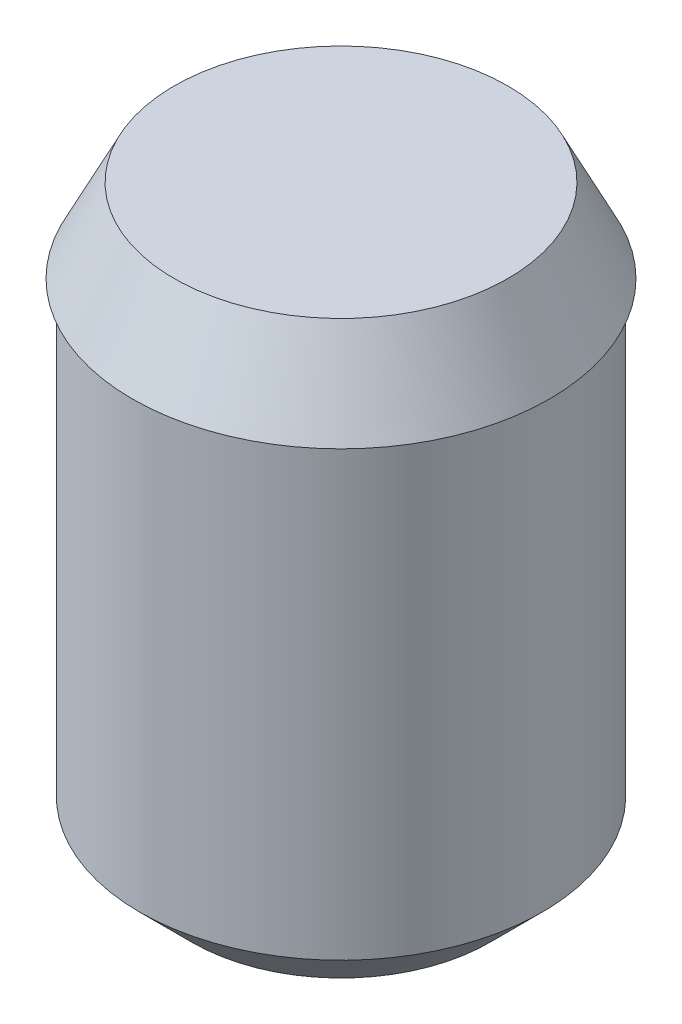
ISO-10303-21;
HEADER;
FILE_DESCRIPTION(('STEP AP214'),'2;1');
FILE_NAME('part.step','',(''),(''),'','','');
FILE_SCHEMA(('AUTOMOTIVE_DESIGN { 1 0 10303 214 1 1 1 1 }'));
ENDSEC;
DATA;
#1=APPLICATION_CONTEXT('core data for automotive mechanical design processes');
#2=APPLICATION_PROTOCOL_DEFINITION('international standard','automotive_design',2000,#1);
#3=PRODUCT_CONTEXT('',#1,'mechanical');
#4=PRODUCT('Part','Part','',(#3));
#5=PRODUCT_RELATED_PRODUCT_CATEGORY('part','',(#4));
#6=PRODUCT_DEFINITION_FORMATION('','',#4);
#7=PRODUCT_DEFINITION_CONTEXT('part definition',#1,'design');
#8=PRODUCT_DEFINITION('design','',#6,#7);
#9=PRODUCT_DEFINITION_SHAPE('','',#8);
#10=(LENGTH_UNIT() NAMED_UNIT(*) SI_UNIT(.MILLI.,.METRE.));
#11=(NAMED_UNIT(*) PLANE_ANGLE_UNIT() SI_UNIT($,.RADIAN.));
#12=(NAMED_UNIT(*) SI_UNIT($,.STERADIAN.) SOLID_ANGLE_UNIT());
#13=UNCERTAINTY_MEASURE_WITH_UNIT(LENGTH_MEASURE(1.E-05),#10,'distance_accuracy_value','');
#14=(GEOMETRIC_REPRESENTATION_CONTEXT(3) GLOBAL_UNCERTAINTY_ASSIGNED_CONTEXT((#13)) GLOBAL_UNIT_ASSIGNED_CONTEXT((#10,
#11,#12)) REPRESENTATION_CONTEXT('',''));
#15=CARTESIAN_POINT('',(0.,0.,0.));
#16=DIRECTION('',(0.,0.,1.));
#17=DIRECTION('',(1.,0.,0.));
#18=AXIS2_PLACEMENT_3D('',#15,#16,#17);
#19=CARTESIAN_POINT('',(0.,7.,0.));
#20=DIRECTION('',(0.,-1.,0.));
#21=DIRECTION('',(0.,0.,-1.));
#22=AXIS2_PLACEMENT_3D('',#19,#20,#21);
#23=PLANE('',#22);
#24=CARTESIAN_POINT('',(0.,7.,0.));
#25=DIRECTION('',(0.,-1.,0.));
#26=DIRECTION('',(0.,0.,-1.));
#27=AXIS2_PLACEMENT_3D('',#24,#25,#26);
#28=CIRCLE('',#27,2.);
#29=CARTESIAN_POINT('',(0.,7.,-2.));
#30=VERTEX_POINT('',#29);
#31=EDGE_CURVE('E10',#30,#30,#28,.T.);
#32=ORIENTED_EDGE('',*,*,#31,.F.);
#33=EDGE_LOOP('',(#32));
#34=FACE_BOUND('',#33,.T.);
#35=ADVANCED_FACE('F45',(#34),#23,.F.);
#36=CARTESIAN_POINT('',(0.,7.,0.));
#37=DIRECTION('',(0.,-1.,0.));
#38=DIRECTION('',(0.,0.,-1.));
#39=AXIS2_PLACEMENT_3D('',#36,#37,#38);
#40=CONICAL_SURFACE('',#39,2.,0.463647609000807);
#41=CARTESIAN_POINT('',(0.,6.,0.));
#42=DIRECTION('',(0.,1.,0.));
#43=DIRECTION('',(0.,0.,1.));
#44=AXIS2_PLACEMENT_3D('',#41,#42,#43);
#45=CIRCLE('',#44,2.5);
#46=CARTESIAN_POINT('',(0.,6.,2.5));
#47=VERTEX_POINT('',#46);
#48=EDGE_CURVE('E58',#47,#47,#45,.T.);
#49=ORIENTED_EDGE('',*,*,#48,.T.);
#50=EDGE_LOOP('',(#49));
#51=FACE_BOUND('',#50,.T.);
#52=ORIENTED_EDGE('',*,*,#31,.T.);
#53=EDGE_LOOP('',(#52));
#54=FACE_BOUND('',#53,.T.);
#55=ADVANCED_FACE('F87',(#51,#54),#40,.T.);
#56=CARTESIAN_POINT('',(0.,0.,0.));
#57=DIRECTION('',(0.,1.,0.));
#58=DIRECTION('',(0.,0.,1.));
#59=AXIS2_PLACEMENT_3D('',#56,#57,#58);
#60=CYLINDRICAL_SURFACE('',#59,2.413);
#61=CARTESIAN_POINT('',(0.,6.,0.));
#62=DIRECTION('',(0.,1.,0.));
#63=DIRECTION('',(0.,0.,1.));
#64=AXIS2_PLACEMENT_3D('',#61,#62,#63);
#65=CIRCLE('',#64,2.413);
#66=CARTESIAN_POINT('',(0.,6.,2.413));
#67=VERTEX_POINT('',#66);
#68=EDGE_CURVE('E53',#67,#67,#65,.T.);
#69=ORIENTED_EDGE('',*,*,#68,.F.);
#70=EDGE_LOOP('',(#69));
#71=FACE_BOUND('',#70,.T.);
#72=CARTESIAN_POINT('',(0.,0.629919999999989,0.));
#73=DIRECTION('',(0.,1.,0.));
#74=DIRECTION('',(0.,0.,1.));
#75=AXIS2_PLACEMENT_3D('',#72,#73,#74);
#76=CIRCLE('',#75,2.413);
#77=CARTESIAN_POINT('',(0.,0.629919999999989,2.413));
#78=VERTEX_POINT('',#77);
#79=EDGE_CURVE('E69',#78,#78,#76,.T.);
#80=ORIENTED_EDGE('',*,*,#79,.T.);
#81=EDGE_LOOP('',(#80));
#82=FACE_BOUND('',#81,.T.);
#83=ADVANCED_FACE('F74',(#71,#82),#60,.T.);
#84=CARTESIAN_POINT('',(2.413,6.,0.));
#85=DIRECTION('',(0.,1.,0.));
#86=DIRECTION('',(0.,0.,1.));
#87=AXIS2_PLACEMENT_3D('',#84,#85,#86);
#88=PLANE('',#87);
#89=ORIENTED_EDGE('',*,*,#48,.F.);
#90=EDGE_LOOP('',(#89));
#91=FACE_BOUND('',#90,.T.);
#92=ORIENTED_EDGE('',*,*,#68,.T.);
#93=EDGE_LOOP('',(#92));
#94=FACE_BOUND('',#93,.T.);
#95=ADVANCED_FACE('F79',(#91,#94),#88,.F.);
#96=CARTESIAN_POINT('',(0.,0.,0.));
#97=DIRECTION('',(0.,1.,0.));
#98=DIRECTION('',(0.,0.,1.));
#99=AXIS2_PLACEMENT_3D('',#96,#97,#98);
#100=CONICAL_SURFACE('',#99,1.78308,0.785398163397456);
#101=ORIENTED_EDGE('',*,*,#79,.F.);
#102=EDGE_LOOP('',(#101));
#103=FACE_BOUND('',#102,.T.);
#104=CARTESIAN_POINT('',(0.,0.,0.));
#105=DIRECTION('',(0.,1.,0.));
#106=DIRECTION('',(0.,0.,1.));
#107=AXIS2_PLACEMENT_3D('',#104,#105,#106);
#108=CIRCLE('',#107,1.78308);
#109=CARTESIAN_POINT('',(0.,0.,1.78308));
#110=VERTEX_POINT('',#109);
#111=EDGE_CURVE('E63',#110,#110,#108,.T.);
#112=ORIENTED_EDGE('',*,*,#111,.T.);
#113=EDGE_LOOP('',(#112));
#114=FACE_BOUND('',#113,.T.);
#115=ADVANCED_FACE('F76',(#103,#114),#100,.T.);
#116=CARTESIAN_POINT('',(-2.5,0.,0.));
#117=DIRECTION('',(0.,1.,0.));
#118=DIRECTION('',(0.,0.,1.));
#119=AXIS2_PLACEMENT_3D('',#116,#117,#118);
#120=PLANE('',#119);
#121=ORIENTED_EDGE('',*,*,#111,.F.);
#122=EDGE_LOOP('',(#121));
#123=FACE_BOUND('',#122,.T.);
#124=ADVANCED_FACE('F47',(#123),#120,.F.);
#125=CLOSED_SHELL('',(#35,#55,#83,#95,#115,#124));
#126=MANIFOLD_SOLID_BREP('B2',#125);
#127=ADVANCED_BREP_SHAPE_REPRESENTATION('',(#18,#126),#14);
#128=SHAPE_DEFINITION_REPRESENTATION(#9,#127);
ENDSEC;
END-ISO-10303-21;
